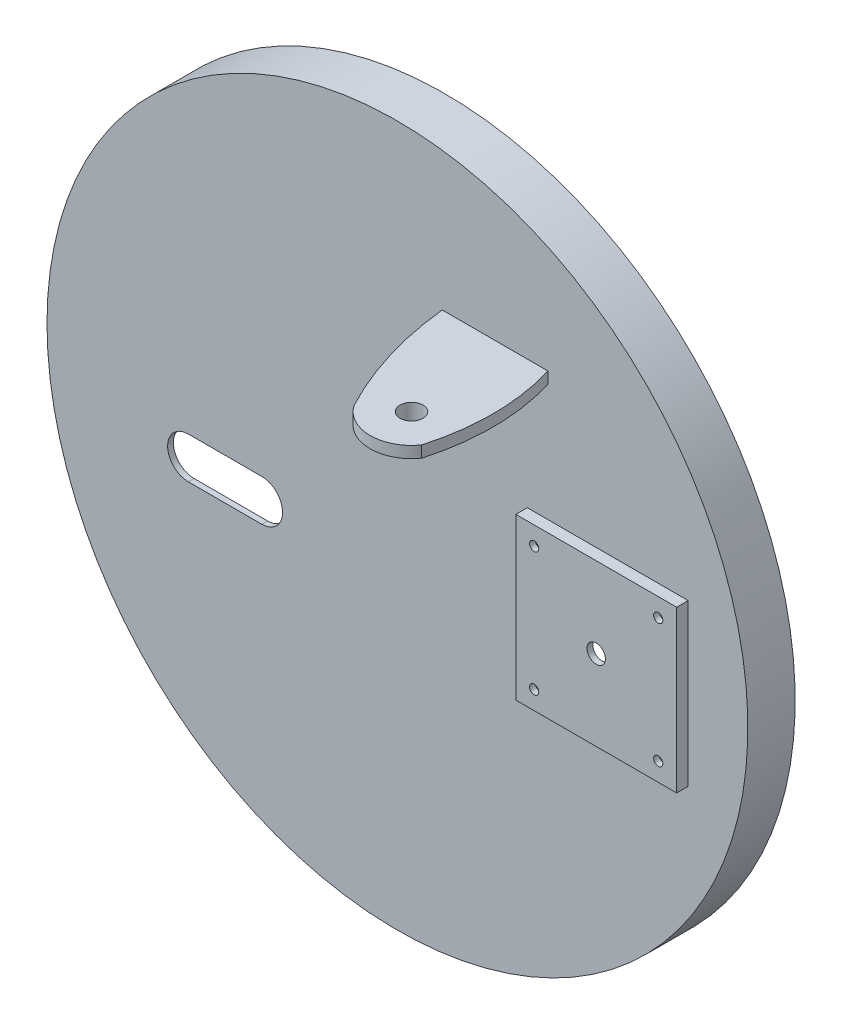
ISO-10303-21;
HEADER;
FILE_DESCRIPTION(('STEP AP214'),'2;1');
FILE_NAME('part.step','',(''),(''),'','','');
FILE_SCHEMA(('AUTOMOTIVE_DESIGN { 1 0 10303 214 1 1 1 1 }'));
ENDSEC;
DATA;
#1=APPLICATION_CONTEXT('core data for automotive mechanical design processes');
#2=APPLICATION_PROTOCOL_DEFINITION('international standard','automotive_design',2000,#1);
#3=PRODUCT_CONTEXT('',#1,'mechanical');
#4=PRODUCT('Part','Part','',(#3));
#5=PRODUCT_RELATED_PRODUCT_CATEGORY('part','',(#4));
#6=PRODUCT_DEFINITION_FORMATION('','',#4);
#7=PRODUCT_DEFINITION_CONTEXT('part definition',#1,'design');
#8=PRODUCT_DEFINITION('design','',#6,#7);
#9=PRODUCT_DEFINITION_SHAPE('','',#8);
#10=(LENGTH_UNIT() NAMED_UNIT(*) SI_UNIT(.MILLI.,.METRE.));
#11=(NAMED_UNIT(*) PLANE_ANGLE_UNIT() SI_UNIT($,.RADIAN.));
#12=(NAMED_UNIT(*) SI_UNIT($,.STERADIAN.) SOLID_ANGLE_UNIT());
#13=UNCERTAINTY_MEASURE_WITH_UNIT(LENGTH_MEASURE(1.E-05),#10,'distance_accuracy_value','');
#14=(GEOMETRIC_REPRESENTATION_CONTEXT(3) GLOBAL_UNCERTAINTY_ASSIGNED_CONTEXT((#13)) GLOBAL_UNIT_ASSIGNED_CONTEXT((#10,
#11,#12)) REPRESENTATION_CONTEXT('',''));
#15=CARTESIAN_POINT('',(0.,0.,0.));
#16=DIRECTION('',(0.,0.,1.));
#17=DIRECTION('',(1.,0.,0.));
#18=AXIS2_PLACEMENT_3D('',#15,#16,#17);
#19=CARTESIAN_POINT('',(39.,172.01941469311,191.2));
#20=DIRECTION('',(0.,1.,0.));
#21=DIRECTION('',(0.,0.,1.));
#22=AXIS2_PLACEMENT_3D('',#19,#20,#21);
#23=PLANE('',#22);
#24=CARTESIAN_POINT('',(337.446035567182,172.01941469311,10.7046912750073));
#25=DIRECTION('',(0.,-1.,0.));
#26=DIRECTION('',(0.,0.,-1.));
#27=AXIS2_PLACEMENT_3D('',#24,#25,#26);
#28=CIRCLE('',#27,300.);
#29=CARTESIAN_POINT('',(72.481683860342,172.01941469311,151.395459716203));
#30=VERTEX_POINT('',#29);
#31=CARTESIAN_POINT('',(39.,172.01941469311,41.2));
#32=VERTEX_POINT('',#31);
#33=EDGE_CURVE('E56',#30,#32,#28,.T.);
#34=ORIENTED_EDGE('',*,*,#33,.T.);
#35=DIRECTION('',(1.,0.,0.));
#36=VECTOR('',#35,1.);
#37=CARTESIAN_POINT('',(39.,172.01941469311,41.2));
#38=LINE('',#37,#36);
#39=CARTESIAN_POINT('',(131.,172.01941469311,41.2));
#40=VERTEX_POINT('',#39);
#41=EDGE_CURVE('E175',#32,#40,#38,.T.);
#42=ORIENTED_EDGE('',*,*,#41,.T.);
#43=CARTESIAN_POINT('',(-55.6000664272192,172.01941469311,97.8163864032083));
#44=DIRECTION('',(0.,-1.,0.));
#45=DIRECTION('',(0.,0.,-1.));
#46=AXIS2_PLACEMENT_3D('',#43,#44,#45);
#47=CIRCLE('',#46,195.);
#48=CARTESIAN_POINT('',(131.75873165795,172.01941469311,151.868960625725));
#49=VERTEX_POINT('',#48);
#50=EDGE_CURVE('E159',#40,#49,#47,.T.);
#51=ORIENTED_EDGE('',*,*,#50,.T.);
#52=CARTESIAN_POINT('',(102.283418824119,172.01941469311,131.2));
#53=DIRECTION('',(0.,-1.,0.));
#54=DIRECTION('',(0.,0.,-1.));
#55=AXIS2_PLACEMENT_3D('',#52,#53,#54);
#56=CIRCLE('',#55,36.);
#57=EDGE_CURVE('E169',#49,#30,#56,.T.);
#58=ORIENTED_EDGE('',*,*,#57,.T.);
#59=EDGE_LOOP('',(#34,#42,#51,#58));
#60=FACE_BOUND('',#59,.T.);
#61=CARTESIAN_POINT('',(102.283418824119,172.01941469311,131.2));
#62=DIRECTION('',(0.,1.,0.));
#63=DIRECTION('',(0.,0.,1.));
#64=AXIS2_PLACEMENT_3D('',#61,#62,#63);
#65=CIRCLE('',#64,20.);
#66=CARTESIAN_POINT('',(102.283418824119,172.01941469311,151.2));
#67=VERTEX_POINT('',#66);
#68=EDGE_CURVE('E48',#67,#67,#65,.F.);
#69=ORIENTED_EDGE('',*,*,#68,.F.);
#70=EDGE_LOOP('',(#69));
#71=FACE_BOUND('',#70,.T.);
#72=ADVANCED_FACE('F39',(#60,#71),#23,.F.);
#73=CARTESIAN_POINT('',(39.,182.01941469311,191.2));
#74=DIRECTION('',(0.,-1.,0.));
#75=DIRECTION('',(0.,0.,-1.));
#76=AXIS2_PLACEMENT_3D('',#73,#74,#75);
#77=PLANE('',#76);
#78=CARTESIAN_POINT('',(102.283418824119,182.01941469311,131.2));
#79=DIRECTION('',(0.,-1.,0.));
#80=DIRECTION('',(0.,0.,-1.));
#81=AXIS2_PLACEMENT_3D('',#78,#79,#80);
#82=CIRCLE('',#81,10.);
#83=CARTESIAN_POINT('',(102.283418824119,182.01941469311,121.2));
#84=VERTEX_POINT('',#83);
#85=EDGE_CURVE('E333',#84,#84,#82,.T.);
#86=ORIENTED_EDGE('',*,*,#85,.T.);
#87=EDGE_LOOP('',(#86));
#88=FACE_BOUND('',#87,.T.);
#89=CARTESIAN_POINT('',(337.446035567182,182.01941469311,10.7046912750073));
#90=DIRECTION('',(0.,-1.,0.));
#91=DIRECTION('',(0.,0.,-1.));
#92=AXIS2_PLACEMENT_3D('',#89,#90,#91);
#93=CIRCLE('',#92,300.);
#94=CARTESIAN_POINT('',(72.481683860342,182.01941469311,151.395459716203));
#95=VERTEX_POINT('',#94);
#96=CARTESIAN_POINT('',(39.,182.01941469311,41.2));
#97=VERTEX_POINT('',#96);
#98=EDGE_CURVE('E184',#95,#97,#93,.T.);
#99=ORIENTED_EDGE('',*,*,#98,.F.);
#100=CARTESIAN_POINT('',(102.283418824119,182.01941469311,131.2));
#101=DIRECTION('',(0.,-1.,0.));
#102=DIRECTION('',(0.,0.,-1.));
#103=AXIS2_PLACEMENT_3D('',#100,#101,#102);
#104=CIRCLE('',#103,36.);
#105=CARTESIAN_POINT('',(131.75873165795,182.01941469311,151.868960625725));
#106=VERTEX_POINT('',#105);
#107=EDGE_CURVE('E180',#106,#95,#104,.T.);
#108=ORIENTED_EDGE('',*,*,#107,.F.);
#109=CARTESIAN_POINT('',(-55.6000664272192,182.01941469311,97.8163864032083));
#110=DIRECTION('',(0.,-1.,0.));
#111=DIRECTION('',(0.,0.,-1.));
#112=AXIS2_PLACEMENT_3D('',#109,#110,#111);
#113=CIRCLE('',#112,195.);
#114=CARTESIAN_POINT('',(131.,182.01941469311,41.2));
#115=VERTEX_POINT('',#114);
#116=EDGE_CURVE('E162',#115,#106,#113,.T.);
#117=ORIENTED_EDGE('',*,*,#116,.F.);
#118=DIRECTION('',(-1.,0.,0.));
#119=VECTOR('',#118,1.);
#120=CARTESIAN_POINT('',(39.,182.01941469311,41.2));
#121=LINE('',#120,#119);
#122=EDGE_CURVE('E186',#115,#97,#121,.T.);
#123=ORIENTED_EDGE('',*,*,#122,.T.);
#124=EDGE_LOOP('',(#99,#108,#117,#123));
#125=FACE_BOUND('',#124,.T.);
#126=ADVANCED_FACE('F342',(#88,#125),#77,.F.);
#127=CARTESIAN_POINT('',(0.,0.,41.2));
#128=DIRECTION('',(0.,0.,1.));
#129=DIRECTION('',(1.,0.,0.));
#130=AXIS2_PLACEMENT_3D('',#127,#128,#129);
#131=PLANE('',#130);
#132=DIRECTION('',(0.,-1.,0.));
#133=VECTOR('',#132,1.);
#134=CARTESIAN_POINT('',(39.,182.01941469311,41.2));
#135=LINE('',#134,#133);
#136=EDGE_CURVE('E189',#97,#32,#135,.T.);
#137=ORIENTED_EDGE('',*,*,#136,.F.);
#138=ORIENTED_EDGE('',*,*,#122,.F.);
#139=DIRECTION('',(0.,-1.,0.));
#140=VECTOR('',#139,1.);
#141=CARTESIAN_POINT('',(131.,322.01941469311,41.2));
#142=LINE('',#141,#140);
#143=EDGE_CURVE('E165',#115,#40,#142,.T.);
#144=ORIENTED_EDGE('',*,*,#143,.T.);
#145=ORIENTED_EDGE('',*,*,#41,.F.);
#146=EDGE_LOOP('',(#137,#138,#144,#145));
#147=FACE_BOUND('',#146,.T.);
#148=CARTESIAN_POINT('',(0.,0.,41.2));
#149=DIRECTION('',(0.,0.,1.));
#150=DIRECTION('',(1.,0.,0.));
#151=AXIS2_PLACEMENT_3D('',#148,#149,#150);
#152=CIRCLE('',#151,305.);
#153=CARTESIAN_POINT('',(-305.,0.,41.2));
#154=VERTEX_POINT('',#153);
#155=EDGE_CURVE('E282',#154,#154,#152,.T.);
#156=ORIENTED_EDGE('',*,*,#155,.T.);
#157=EDGE_LOOP('',(#156));
#158=FACE_BOUND('',#157,.T.);
#159=DIRECTION('',(0.,-1.,0.));
#160=VECTOR('',#159,1.);
#161=CARTESIAN_POINT('',(253.,70.,41.2));
#162=LINE('',#161,#160);
#163=CARTESIAN_POINT('',(253.,70.,41.2));
#164=VERTEX_POINT('',#163);
#165=CARTESIAN_POINT('',(253.,-70.,41.2));
#166=VERTEX_POINT('',#165);
#167=EDGE_CURVE('E265',#164,#166,#162,.T.);
#168=ORIENTED_EDGE('',*,*,#167,.T.);
#169=DIRECTION('',(1.,0.,0.));
#170=VECTOR('',#169,1.);
#171=CARTESIAN_POINT('',(113.,-70.,41.2));
#172=LINE('',#171,#170);
#173=CARTESIAN_POINT('',(113.,-70.,41.2));
#174=VERTEX_POINT('',#173);
#175=EDGE_CURVE('E217',#174,#166,#172,.T.);
#176=ORIENTED_EDGE('',*,*,#175,.F.);
#177=DIRECTION('',(0.,-1.,0.));
#178=VECTOR('',#177,1.);
#179=CARTESIAN_POINT('',(113.,70.,41.2));
#180=LINE('',#179,#178);
#181=CARTESIAN_POINT('',(113.,70.,41.2));
#182=VERTEX_POINT('',#181);
#183=EDGE_CURVE('E254',#182,#174,#180,.T.);
#184=ORIENTED_EDGE('',*,*,#183,.F.);
#185=DIRECTION('',(1.,0.,0.));
#186=VECTOR('',#185,1.);
#187=CARTESIAN_POINT('',(113.,70.,41.2));
#188=LINE('',#187,#186);
#189=EDGE_CURVE('E268',#182,#164,#188,.T.);
#190=ORIENTED_EDGE('',*,*,#189,.T.);
#191=EDGE_LOOP('',(#168,#176,#184,#190));
#192=FACE_BOUND('',#191,.T.);
#193=DIRECTION('',(-1.,0.,0.));
#194=VECTOR('',#193,1.);
#195=CARTESIAN_POINT('',(0.,-58.,41.2));
#196=LINE('',#195,#194);
#197=CARTESIAN_POINT('',(-118.,-58.,41.2));
#198=VERTEX_POINT('',#197);
#199=CARTESIAN_POINT('',(-182.,-58.,41.2));
#200=VERTEX_POINT('',#199);
#201=EDGE_CURVE('E207',#198,#200,#196,.T.);
#202=ORIENTED_EDGE('',*,*,#201,.T.);
#203=CARTESIAN_POINT('',(-182.,-40.,41.2));
#204=DIRECTION('',(0.,0.,1.));
#205=DIRECTION('',(1.,0.,0.));
#206=AXIS2_PLACEMENT_3D('',#203,#204,#205);
#207=CIRCLE('',#206,18.);
#208=CARTESIAN_POINT('',(-182.,-22.,41.2));
#209=VERTEX_POINT('',#208);
#210=EDGE_CURVE('E210',#200,#209,#207,.F.);
#211=ORIENTED_EDGE('',*,*,#210,.T.);
#212=DIRECTION('',(1.,0.,0.));
#213=VECTOR('',#212,1.);
#214=CARTESIAN_POINT('',(0.,-22.,41.2));
#215=LINE('',#214,#213);
#216=CARTESIAN_POINT('',(-118.,-22.,41.2));
#217=VERTEX_POINT('',#216);
#218=EDGE_CURVE('E201',#209,#217,#215,.T.);
#219=ORIENTED_EDGE('',*,*,#218,.T.);
#220=CARTESIAN_POINT('',(-118.,-40.,41.2));
#221=DIRECTION('',(0.,0.,1.));
#222=DIRECTION('',(1.,0.,0.));
#223=AXIS2_PLACEMENT_3D('',#220,#221,#222);
#224=CIRCLE('',#223,18.);
#225=EDGE_CURVE('E204',#217,#198,#224,.F.);
#226=ORIENTED_EDGE('',*,*,#225,.T.);
#227=EDGE_LOOP('',(#202,#211,#219,#226));
#228=FACE_BOUND('',#227,.T.);
#229=ADVANCED_FACE('F337',(#147,#158,#192,#228),#131,.T.);
#230=CARTESIAN_POINT('',(0.,0.,36.2));
#231=DIRECTION('',(0.,0.,1.));
#232=DIRECTION('',(1.,0.,0.));
#233=AXIS2_PLACEMENT_3D('',#230,#231,#232);
#234=PLANE('',#233);
#235=CARTESIAN_POINT('',(0.,0.,36.2));
#236=DIRECTION('',(0.,0.,1.));
#237=DIRECTION('',(1.,0.,0.));
#238=AXIS2_PLACEMENT_3D('',#235,#236,#237);
#239=CIRCLE('',#238,85.);
#240=CARTESIAN_POINT('',(85.,0.,36.2));
#241=VERTEX_POINT('',#240);
#242=EDGE_CURVE('E11',#241,#241,#239,.F.);
#243=ORIENTED_EDGE('',*,*,#242,.F.);
#244=EDGE_LOOP('',(#243));
#245=FACE_BOUND('',#244,.T.);
#246=DIRECTION('',(0.,-1.,0.));
#247=VECTOR('',#246,1.);
#248=CARTESIAN_POINT('',(248.,70.,36.2));
#249=LINE('',#248,#247);
#250=CARTESIAN_POINT('',(248.,65.,36.2));
#251=VERTEX_POINT('',#250);
#252=CARTESIAN_POINT('',(248.,-65.,36.2));
#253=VERTEX_POINT('',#252);
#254=EDGE_CURVE('E219',#251,#253,#249,.T.);
#255=ORIENTED_EDGE('',*,*,#254,.F.);
#256=DIRECTION('',(1.,0.,0.));
#257=VECTOR('',#256,1.);
#258=CARTESIAN_POINT('',(113.,65.,36.2));
#259=LINE('',#258,#257);
#260=CARTESIAN_POINT('',(118.,65.,36.2));
#261=VERTEX_POINT('',#260);
#262=EDGE_CURVE('E222',#261,#251,#259,.T.);
#263=ORIENTED_EDGE('',*,*,#262,.F.);
#264=DIRECTION('',(0.,-1.,0.));
#265=VECTOR('',#264,1.);
#266=CARTESIAN_POINT('',(118.,70.,36.2));
#267=LINE('',#266,#265);
#268=CARTESIAN_POINT('',(118.,-65.,36.2));
#269=VERTEX_POINT('',#268);
#270=EDGE_CURVE('E225',#261,#269,#267,.T.);
#271=ORIENTED_EDGE('',*,*,#270,.T.);
#272=DIRECTION('',(1.,0.,0.));
#273=VECTOR('',#272,1.);
#274=CARTESIAN_POINT('',(113.,-65.,36.2));
#275=LINE('',#274,#273);
#276=EDGE_CURVE('E213',#269,#253,#275,.T.);
#277=ORIENTED_EDGE('',*,*,#276,.T.);
#278=EDGE_LOOP('',(#255,#263,#271,#277));
#279=FACE_BOUND('',#278,.T.);
#280=CARTESIAN_POINT('',(0.,0.,36.2));
#281=DIRECTION('',(0.,0.,1.));
#282=DIRECTION('',(1.,0.,0.));
#283=AXIS2_PLACEMENT_3D('',#280,#281,#282);
#284=CIRCLE('',#283,300.);
#285=CARTESIAN_POINT('',(-300.,0.,36.2));
#286=VERTEX_POINT('',#285);
#287=EDGE_CURVE('E214',#286,#286,#284,.T.);
#288=ORIENTED_EDGE('',*,*,#287,.F.);
#289=EDGE_LOOP('',(#288));
#290=FACE_BOUND('',#289,.T.);
#291=CARTESIAN_POINT('',(-182.,-40.,36.2));
#292=DIRECTION('',(0.,0.,1.));
#293=DIRECTION('',(1.,0.,0.));
#294=AXIS2_PLACEMENT_3D('',#291,#292,#293);
#295=CIRCLE('',#294,18.);
#296=CARTESIAN_POINT('',(-182.,-58.,36.2));
#297=VERTEX_POINT('',#296);
#298=CARTESIAN_POINT('',(-182.,-22.,36.2));
#299=VERTEX_POINT('',#298);
#300=EDGE_CURVE('E293',#297,#299,#295,.F.);
#301=ORIENTED_EDGE('',*,*,#300,.F.);
#302=DIRECTION('',(-1.,0.,0.));
#303=VECTOR('',#302,1.);
#304=CARTESIAN_POINT('',(0.,-58.,36.2));
#305=LINE('',#304,#303);
#306=CARTESIAN_POINT('',(-118.,-58.,36.2));
#307=VERTEX_POINT('',#306);
#308=EDGE_CURVE('E291',#307,#297,#305,.T.);
#309=ORIENTED_EDGE('',*,*,#308,.F.);
#310=CARTESIAN_POINT('',(-118.,-40.,36.2));
#311=DIRECTION('',(0.,0.,1.));
#312=DIRECTION('',(1.,0.,0.));
#313=AXIS2_PLACEMENT_3D('',#310,#311,#312);
#314=CIRCLE('',#313,18.);
#315=CARTESIAN_POINT('',(-118.,-22.,36.2));
#316=VERTEX_POINT('',#315);
#317=EDGE_CURVE('E289',#316,#307,#314,.F.);
#318=ORIENTED_EDGE('',*,*,#317,.F.);
#319=DIRECTION('',(1.,0.,0.));
#320=VECTOR('',#319,1.);
#321=CARTESIAN_POINT('',(0.,-22.,36.2));
#322=LINE('',#321,#320);
#323=EDGE_CURVE('E285',#299,#316,#322,.T.);
#324=ORIENTED_EDGE('',*,*,#323,.F.);
#325=EDGE_LOOP('',(#301,#309,#318,#324));
#326=FACE_BOUND('',#325,.T.);
#327=ADVANCED_FACE('F375',(#245,#279,#290,#326),#234,.F.);
#328=CARTESIAN_POINT('',(0.,0.,41.2));
#329=DIRECTION('',(0.,0.,-1.));
#330=DIRECTION('',(-1.,0.,0.));
#331=AXIS2_PLACEMENT_3D('',#328,#329,#330);
#332=CYLINDRICAL_SURFACE('',#331,305.);
#333=CARTESIAN_POINT('',(0.,0.,0.));
#334=DIRECTION('',(0.,0.,1.));
#335=DIRECTION('',(1.,0.,0.));
#336=AXIS2_PLACEMENT_3D('',#333,#334,#335);
#337=CIRCLE('',#336,305.);
#338=CARTESIAN_POINT('',(-305.,0.,0.));
#339=VERTEX_POINT('',#338);
#340=EDGE_CURVE('E281',#339,#339,#337,.T.);
#341=CARTESIAN_POINT('',(-305.,0.,41.2));
#342=CARTESIAN_POINT('',(-305.,0.,40.7708333333333));
#343=CARTESIAN_POINT('',(-305.,0.,40.3416666666667));
#344=CARTESIAN_POINT('',(-305.,0.,39.4833333333333));
#345=CARTESIAN_POINT('',(-305.,0.,39.0541666666667));
#346=CARTESIAN_POINT('',(-305.,0.,38.1958333333333));
#347=CARTESIAN_POINT('',(-305.,0.,37.7666666666667));
#348=CARTESIAN_POINT('',(-305.,0.,36.9083333333333));
#349=CARTESIAN_POINT('',(-305.,0.,36.4791666666667));
#350=CARTESIAN_POINT('',(-305.,0.,35.6208333333333));
#351=CARTESIAN_POINT('',(-305.,0.,35.1916666666667));
#352=CARTESIAN_POINT('',(-305.,0.,34.3333333333333));
#353=CARTESIAN_POINT('',(-305.,0.,33.9041666666667));
#354=CARTESIAN_POINT('',(-305.,0.,33.0458333333333));
#355=CARTESIAN_POINT('',(-305.,0.,32.6166666666667));
#356=CARTESIAN_POINT('',(-305.,0.,31.7583333333333));
#357=CARTESIAN_POINT('',(-305.,0.,31.3291666666667));
#358=CARTESIAN_POINT('',(-305.,0.,30.4708333333333));
#359=CARTESIAN_POINT('',(-305.,0.,30.0416666666667));
#360=CARTESIAN_POINT('',(-305.,0.,29.1833333333333));
#361=CARTESIAN_POINT('',(-305.,0.,28.7541666666667));
#362=CARTESIAN_POINT('',(-305.,0.,27.8958333333333));
#363=CARTESIAN_POINT('',(-305.,0.,27.4666666666667));
#364=CARTESIAN_POINT('',(-305.,0.,26.6083333333333));
#365=CARTESIAN_POINT('',(-305.,0.,26.1791666666667));
#366=CARTESIAN_POINT('',(-305.,0.,25.3208333333333));
#367=CARTESIAN_POINT('',(-305.,0.,24.8916666666667));
#368=CARTESIAN_POINT('',(-305.,0.,24.0333333333333));
#369=CARTESIAN_POINT('',(-305.,0.,23.6041666666667));
#370=CARTESIAN_POINT('',(-305.,0.,22.7458333333333));
#371=CARTESIAN_POINT('',(-305.,0.,22.3166666666667));
#372=CARTESIAN_POINT('',(-305.,0.,21.4583333333333));
#373=CARTESIAN_POINT('',(-305.,0.,21.0291666666667));
#374=CARTESIAN_POINT('',(-305.,0.,20.1708333333333));
#375=CARTESIAN_POINT('',(-305.,0.,19.7416666666667));
#376=CARTESIAN_POINT('',(-305.,0.,18.8833333333333));
#377=CARTESIAN_POINT('',(-305.,0.,18.4541666666667));
#378=CARTESIAN_POINT('',(-305.,0.,17.5958333333333));
#379=CARTESIAN_POINT('',(-305.,0.,17.1666666666667));
#380=CARTESIAN_POINT('',(-305.,0.,16.3083333333333));
#381=CARTESIAN_POINT('',(-305.,0.,15.8791666666667));
#382=CARTESIAN_POINT('',(-305.,0.,15.0208333333333));
#383=CARTESIAN_POINT('',(-305.,0.,14.5916666666667));
#384=CARTESIAN_POINT('',(-305.,0.,13.7333333333333));
#385=CARTESIAN_POINT('',(-305.,0.,13.3041666666667));
#386=CARTESIAN_POINT('',(-305.,0.,12.4458333333333));
#387=CARTESIAN_POINT('',(-305.,0.,12.0166666666667));
#388=CARTESIAN_POINT('',(-305.,0.,11.1583333333333));
#389=CARTESIAN_POINT('',(-305.,0.,10.7291666666667));
#390=CARTESIAN_POINT('',(-305.,0.,9.87083333333333));
#391=CARTESIAN_POINT('',(-305.,0.,9.44166666666666));
#392=CARTESIAN_POINT('',(-305.,0.,8.58333333333333));
#393=CARTESIAN_POINT('',(-305.,0.,8.15416666666666));
#394=CARTESIAN_POINT('',(-305.,0.,7.29583333333333));
#395=CARTESIAN_POINT('',(-305.,0.,6.86666666666666));
#396=CARTESIAN_POINT('',(-305.,0.,6.00833333333333));
#397=CARTESIAN_POINT('',(-305.,0.,5.57916666666666));
#398=CARTESIAN_POINT('',(-305.,0.,4.72083333333333));
#399=CARTESIAN_POINT('',(-305.,0.,4.29166666666666));
#400=CARTESIAN_POINT('',(-305.,0.,3.43333333333333));
#401=CARTESIAN_POINT('',(-305.,0.,3.00416666666666));
#402=CARTESIAN_POINT('',(-305.,0.,2.14583333333333));
#403=CARTESIAN_POINT('',(-305.,0.,1.71666666666666));
#404=CARTESIAN_POINT('',(-305.,0.,0.858333333333325));
#405=CARTESIAN_POINT('',(-305.,0.,0.429166666666659));
#406=CARTESIAN_POINT('',(-305.,0.,0.));
#407=B_SPLINE_CURVE_WITH_KNOTS('',3,(#341,#342,#343,#344,#345,#346,#347,#348,#349,#350,#351,
#352,#353,#354,#355,#356,#357,#358,#359,#360,#361,#362,#363,#364,#365,#366,#367,#368,#369,#370,
#371,#372,#373,#374,#375,#376,#377,#378,#379,#380,#381,#382,#383,#384,#385,#386,#387,#388,#389,
#390,#391,#392,#393,#394,#395,#396,#397,#398,#399,#400,#401,#402,#403,#404,#405,#406),
.UNSPECIFIED.,.F.,.F.,(4,2,2,2,2,2,2,2,2,2,2,2,2,2,2,2,2,2,2,2,2,2,2,2,2,2,2,2,2,2,2,2,4),(0.,
1.2875,2.575,3.8625,5.15,6.43750000000001,7.725,9.01250000000001,10.3,11.5875,12.875,14.1625,
15.45,16.7375,18.025,19.3125,20.6,21.8875,23.175,24.4625,25.75,27.0375,28.325,29.6125,30.9,
32.1875,33.475,34.7625,36.05,37.3375,38.625,39.9125,41.2),.UNSPECIFIED.);
#408=EDGE_CURVE('BSEAM41',#154,#339,#407,.T.);
#409=ORIENTED_EDGE('',*,*,#155,.F.);
#410=ORIENTED_EDGE('',*,*,#340,.T.);
#411=ORIENTED_EDGE('',*,*,#408,.T.);
#412=ORIENTED_EDGE('',*,*,#408,.F.);
#413=EDGE_LOOP('',(#409,#411,#410,#412));
#414=FACE_BOUND('',#413,.T.);
#415=ADVANCED_FACE('F41',(#414),#332,.T.);
#416=CARTESIAN_POINT('',(0.,0.,0.));
#417=DIRECTION('',(0.,0.,1.));
#418=DIRECTION('',(1.,0.,0.));
#419=AXIS2_PLACEMENT_3D('',#416,#417,#418);
#420=PLANE('',#419);
#421=CARTESIAN_POINT('',(0.,0.,0.));
#422=DIRECTION('',(0.,0.,1.));
#423=DIRECTION('',(1.,0.,0.));
#424=AXIS2_PLACEMENT_3D('',#421,#422,#423);
#425=CIRCLE('',#424,300.);
#426=CARTESIAN_POINT('',(-300.,0.,0.));
#427=VERTEX_POINT('',#426);
#428=EDGE_CURVE('E218',#427,#427,#425,.T.);
#429=ORIENTED_EDGE('',*,*,#428,.T.);
#430=EDGE_LOOP('',(#429));
#431=FACE_BOUND('',#430,.T.);
#432=ORIENTED_EDGE('',*,*,#340,.F.);
#433=EDGE_LOOP('',(#432));
#434=FACE_BOUND('',#433,.T.);
#435=ADVANCED_FACE('F421',(#431,#434),#420,.F.);
#436=CARTESIAN_POINT('',(113.,-70.,51.2));
#437=DIRECTION('',(0.,1.,0.));
#438=DIRECTION('',(0.,0.,1.));
#439=AXIS2_PLACEMENT_3D('',#436,#437,#438);
#440=PLANE('',#439);
#441=ORIENTED_EDGE('',*,*,#175,.T.);
#442=DIRECTION('',(0.,0.,-1.));
#443=VECTOR('',#442,1.);
#444=CARTESIAN_POINT('',(253.,-70.,51.2));
#445=LINE('',#444,#443);
#446=CARTESIAN_POINT('',(253.,-70.,51.2));
#447=VERTEX_POINT('',#446);
#448=EDGE_CURVE('E279',#447,#166,#445,.T.);
#449=ORIENTED_EDGE('',*,*,#448,.F.);
#450=DIRECTION('',(1.,0.,0.));
#451=VECTOR('',#450,1.);
#452=CARTESIAN_POINT('',(113.,-70.,51.2));
#453=LINE('',#452,#451);
#454=CARTESIAN_POINT('',(113.,-70.,51.2));
#455=VERTEX_POINT('',#454);
#456=EDGE_CURVE('E251',#455,#447,#453,.T.);
#457=ORIENTED_EDGE('',*,*,#456,.F.);
#458=DIRECTION('',(0.,0.,-1.));
#459=VECTOR('',#458,1.);
#460=CARTESIAN_POINT('',(113.,-70.,51.2));
#461=LINE('',#460,#459);
#462=EDGE_CURVE('E262',#455,#174,#461,.T.);
#463=ORIENTED_EDGE('',*,*,#462,.T.);
#464=EDGE_LOOP('',(#441,#449,#457,#463));
#465=FACE_BOUND('',#464,.T.);
#466=ADVANCED_FACE('F417',(#465),#440,.F.);
#467=CARTESIAN_POINT('',(253.,70.,51.2));
#468=DIRECTION('',(1.,0.,0.));
#469=DIRECTION('',(0.,1.,0.));
#470=AXIS2_PLACEMENT_3D('',#467,#468,#469);
#471=PLANE('',#470);
#472=ORIENTED_EDGE('',*,*,#167,.F.);
#473=DIRECTION('',(0.,0.,-1.));
#474=VECTOR('',#473,1.);
#475=CARTESIAN_POINT('',(253.,70.,51.2));
#476=LINE('',#475,#474);
#477=CARTESIAN_POINT('',(253.,70.,51.2));
#478=VERTEX_POINT('',#477);
#479=EDGE_CURVE('E277',#478,#164,#476,.T.);
#480=ORIENTED_EDGE('',*,*,#479,.F.);
#481=DIRECTION('',(0.,-1.,0.));
#482=VECTOR('',#481,1.);
#483=CARTESIAN_POINT('',(253.,70.,51.2));
#484=LINE('',#483,#482);
#485=EDGE_CURVE('E253',#478,#447,#484,.T.);
#486=ORIENTED_EDGE('',*,*,#485,.T.);
#487=ORIENTED_EDGE('',*,*,#448,.T.);
#488=EDGE_LOOP('',(#472,#480,#486,#487));
#489=FACE_BOUND('',#488,.T.);
#490=ADVANCED_FACE('F413',(#489),#471,.T.);
#491=CARTESIAN_POINT('',(113.,70.,51.2));
#492=DIRECTION('',(0.,1.,0.));
#493=DIRECTION('',(0.,0.,1.));
#494=AXIS2_PLACEMENT_3D('',#491,#492,#493);
#495=PLANE('',#494);
#496=ORIENTED_EDGE('',*,*,#189,.F.);
#497=DIRECTION('',(0.,0.,-1.));
#498=VECTOR('',#497,1.);
#499=CARTESIAN_POINT('',(113.,70.,51.2));
#500=LINE('',#499,#498);
#501=CARTESIAN_POINT('',(113.,70.,51.2));
#502=VERTEX_POINT('',#501);
#503=EDGE_CURVE('E274',#502,#182,#500,.T.);
#504=ORIENTED_EDGE('',*,*,#503,.F.);
#505=DIRECTION('',(1.,0.,0.));
#506=VECTOR('',#505,1.);
#507=CARTESIAN_POINT('',(113.,70.,51.2));
#508=LINE('',#507,#506);
#509=EDGE_CURVE('E257',#502,#478,#508,.T.);
#510=ORIENTED_EDGE('',*,*,#509,.T.);
#511=ORIENTED_EDGE('',*,*,#479,.T.);
#512=EDGE_LOOP('',(#496,#504,#510,#511));
#513=FACE_BOUND('',#512,.T.);
#514=ADVANCED_FACE('F409',(#513),#495,.T.);
#515=CARTESIAN_POINT('',(113.,70.,51.2));
#516=DIRECTION('',(1.,0.,0.));
#517=DIRECTION('',(0.,1.,0.));
#518=AXIS2_PLACEMENT_3D('',#515,#516,#517);
#519=PLANE('',#518);
#520=ORIENTED_EDGE('',*,*,#183,.T.);
#521=ORIENTED_EDGE('',*,*,#462,.F.);
#522=DIRECTION('',(0.,-1.,0.));
#523=VECTOR('',#522,1.);
#524=CARTESIAN_POINT('',(113.,70.,51.2));
#525=LINE('',#524,#523);
#526=EDGE_CURVE('E260',#502,#455,#525,.T.);
#527=ORIENTED_EDGE('',*,*,#526,.F.);
#528=ORIENTED_EDGE('',*,*,#503,.T.);
#529=EDGE_LOOP('',(#520,#521,#527,#528));
#530=FACE_BOUND('',#529,.T.);
#531=ADVANCED_FACE('F405',(#530),#519,.F.);
#532=CARTESIAN_POINT('',(0.,0.,51.2));
#533=DIRECTION('',(0.,0.,-1.));
#534=DIRECTION('',(-1.,0.,0.));
#535=AXIS2_PLACEMENT_3D('',#532,#533,#534);
#536=PLANE('',#535);
#537=CARTESIAN_POINT('',(183.,0.,51.2));
#538=DIRECTION('',(0.,0.,1.));
#539=DIRECTION('',(1.,0.,0.));
#540=AXIS2_PLACEMENT_3D('',#537,#538,#539);
#541=CIRCLE('',#540,8.00000000000001);
#542=CARTESIAN_POINT('',(191.,0.,51.2));
#543=VERTEX_POINT('',#542);
#544=EDGE_CURVE('E797',#543,#543,#541,.T.);
#545=ORIENTED_EDGE('',*,*,#544,.F.);
#546=EDGE_LOOP('',(#545));
#547=FACE_BOUND('',#546,.T.);
#548=CARTESIAN_POINT('',(237.,54.,51.2));
#549=DIRECTION('',(0.,0.,1.));
#550=DIRECTION('',(1.,0.,0.));
#551=AXIS2_PLACEMENT_3D('',#548,#549,#550);
#552=CIRCLE('',#551,3.99999999999999);
#553=CARTESIAN_POINT('',(241.,54.,51.2));
#554=VERTEX_POINT('',#553);
#555=EDGE_CURVE('E798',#554,#554,#552,.T.);
#556=ORIENTED_EDGE('',*,*,#555,.F.);
#557=EDGE_LOOP('',(#556));
#558=FACE_BOUND('',#557,.T.);
#559=CARTESIAN_POINT('',(129.,-54.,51.2));
#560=DIRECTION('',(0.,0.,1.));
#561=DIRECTION('',(1.,0.,0.));
#562=AXIS2_PLACEMENT_3D('',#559,#560,#561);
#563=CIRCLE('',#562,3.99999999999999);
#564=CARTESIAN_POINT('',(133.,-54.,51.2));
#565=VERTEX_POINT('',#564);
#566=EDGE_CURVE('E801',#565,#565,#563,.T.);
#567=ORIENTED_EDGE('',*,*,#566,.F.);
#568=EDGE_LOOP('',(#567));
#569=FACE_BOUND('',#568,.T.);
#570=CARTESIAN_POINT('',(237.,-54.,51.2));
#571=DIRECTION('',(0.,0.,1.));
#572=DIRECTION('',(1.,0.,0.));
#573=AXIS2_PLACEMENT_3D('',#570,#571,#572);
#574=CIRCLE('',#573,3.99999999999999);
#575=CARTESIAN_POINT('',(241.,-54.,51.2));
#576=VERTEX_POINT('',#575);
#577=EDGE_CURVE('E805',#576,#576,#574,.T.);
#578=ORIENTED_EDGE('',*,*,#577,.F.);
#579=EDGE_LOOP('',(#578));
#580=FACE_BOUND('',#579,.T.);
#581=CARTESIAN_POINT('',(129.,54.,51.2));
#582=DIRECTION('',(0.,0.,1.));
#583=DIRECTION('',(1.,0.,0.));
#584=AXIS2_PLACEMENT_3D('',#581,#582,#583);
#585=CIRCLE('',#584,3.99999999999999);
#586=CARTESIAN_POINT('',(133.,54.,51.2));
#587=VERTEX_POINT('',#586);
#588=EDGE_CURVE('E302',#587,#587,#585,.T.);
#589=ORIENTED_EDGE('',*,*,#588,.F.);
#590=EDGE_LOOP('',(#589));
#591=FACE_BOUND('',#590,.T.);
#592=ORIENTED_EDGE('',*,*,#456,.T.);
#593=ORIENTED_EDGE('',*,*,#485,.F.);
#594=ORIENTED_EDGE('',*,*,#509,.F.);
#595=ORIENTED_EDGE('',*,*,#526,.T.);
#596=EDGE_LOOP('',(#592,#593,#594,#595));
#597=FACE_BOUND('',#596,.T.);
#598=ADVANCED_FACE('F383',(#547,#558,#569,#580,#591,#597),#536,.F.);
#599=CARTESIAN_POINT('',(0.,0.,41.2));
#600=DIRECTION('',(0.,0.,-1.));
#601=DIRECTION('',(-1.,0.,0.));
#602=AXIS2_PLACEMENT_3D('',#599,#600,#601);
#603=CYLINDRICAL_SURFACE('',#602,300.);
#604=CARTESIAN_POINT('',(-300.,0.,36.2));
#605=CARTESIAN_POINT('',(-300.,0.,35.8229166666667));
#606=CARTESIAN_POINT('',(-300.,0.,35.4458333333333));
#607=CARTESIAN_POINT('',(-300.,0.,34.6916666666667));
#608=CARTESIAN_POINT('',(-300.,0.,34.3145833333333));
#609=CARTESIAN_POINT('',(-300.,0.,33.5604166666667));
#610=CARTESIAN_POINT('',(-300.,0.,33.1833333333333));
#611=CARTESIAN_POINT('',(-300.,0.,32.4291666666667));
#612=CARTESIAN_POINT('',(-300.,0.,32.0520833333333));
#613=CARTESIAN_POINT('',(-300.,0.,31.2979166666667));
#614=CARTESIAN_POINT('',(-300.,0.,30.9208333333333));
#615=CARTESIAN_POINT('',(-300.,0.,30.1666666666667));
#616=CARTESIAN_POINT('',(-300.,0.,29.7895833333333));
#617=CARTESIAN_POINT('',(-300.,0.,29.0354166666667));
#618=CARTESIAN_POINT('',(-300.,0.,28.6583333333333));
#619=CARTESIAN_POINT('',(-300.,0.,27.9041666666667));
#620=CARTESIAN_POINT('',(-300.,0.,27.5270833333333));
#621=CARTESIAN_POINT('',(-300.,0.,26.7729166666667));
#622=CARTESIAN_POINT('',(-300.,0.,26.3958333333333));
#623=CARTESIAN_POINT('',(-300.,0.,25.6416666666667));
#624=CARTESIAN_POINT('',(-300.,0.,25.2645833333333));
#625=CARTESIAN_POINT('',(-300.,0.,24.5104166666667));
#626=CARTESIAN_POINT('',(-300.,0.,24.1333333333333));
#627=CARTESIAN_POINT('',(-300.,0.,23.3791666666667));
#628=CARTESIAN_POINT('',(-300.,0.,23.0020833333333));
#629=CARTESIAN_POINT('',(-300.,0.,22.2479166666667));
#630=CARTESIAN_POINT('',(-300.,0.,21.8708333333333));
#631=CARTESIAN_POINT('',(-300.,0.,21.1166666666667));
#632=CARTESIAN_POINT('',(-300.,0.,20.7395833333333));
#633=CARTESIAN_POINT('',(-300.,0.,19.9854166666667));
#634=CARTESIAN_POINT('',(-300.,0.,19.6083333333333));
#635=CARTESIAN_POINT('',(-300.,0.,18.8541666666667));
#636=CARTESIAN_POINT('',(-300.,0.,18.4770833333333));
#637=CARTESIAN_POINT('',(-300.,0.,17.7229166666667));
#638=CARTESIAN_POINT('',(-300.,0.,17.3458333333333));
#639=CARTESIAN_POINT('',(-300.,0.,16.5916666666667));
#640=CARTESIAN_POINT('',(-300.,0.,16.2145833333333));
#641=CARTESIAN_POINT('',(-300.,0.,15.4604166666667));
#642=CARTESIAN_POINT('',(-300.,0.,15.0833333333333));
#643=CARTESIAN_POINT('',(-300.,0.,14.3291666666667));
#644=CARTESIAN_POINT('',(-300.,0.,13.9520833333333));
#645=CARTESIAN_POINT('',(-300.,0.,13.1979166666667));
#646=CARTESIAN_POINT('',(-300.,0.,12.8208333333333));
#647=CARTESIAN_POINT('',(-300.,0.,12.0666666666667));
#648=CARTESIAN_POINT('',(-300.,0.,11.6895833333333));
#649=CARTESIAN_POINT('',(-300.,0.,10.9354166666667));
#650=CARTESIAN_POINT('',(-300.,0.,10.5583333333333));
#651=CARTESIAN_POINT('',(-300.,0.,9.80416666666666));
#652=CARTESIAN_POINT('',(-300.,0.,9.42708333333333));
#653=CARTESIAN_POINT('',(-300.,0.,8.67291666666666));
#654=CARTESIAN_POINT('',(-300.,0.,8.29583333333333));
#655=CARTESIAN_POINT('',(-300.,0.,7.54166666666666));
#656=CARTESIAN_POINT('',(-300.,0.,7.16458333333333));
#657=CARTESIAN_POINT('',(-300.,0.,6.41041666666666));
#658=CARTESIAN_POINT('',(-300.,0.,6.03333333333333));
#659=CARTESIAN_POINT('',(-300.,0.,5.27916666666666));
#660=CARTESIAN_POINT('',(-300.,0.,4.90208333333333));
#661=CARTESIAN_POINT('',(-300.,0.,4.14791666666666));
#662=CARTESIAN_POINT('',(-300.,0.,3.77083333333333));
#663=CARTESIAN_POINT('',(-300.,0.,3.01666666666666));
#664=CARTESIAN_POINT('',(-300.,0.,2.63958333333333));
#665=CARTESIAN_POINT('',(-300.,0.,1.88541666666666));
#666=CARTESIAN_POINT('',(-300.,0.,1.50833333333333));
#667=CARTESIAN_POINT('',(-300.,0.,0.75416666666666));
#668=CARTESIAN_POINT('',(-300.,0.,0.377083333333327));
#669=CARTESIAN_POINT('',(-300.,0.,0.));
#670=B_SPLINE_CURVE_WITH_KNOTS('',3,(#604,#605,#606,#607,#608,#609,#610,#611,#612,#613,#614,
#615,#616,#617,#618,#619,#620,#621,#622,#623,#624,#625,#626,#627,#628,#629,#630,#631,#632,#633,
#634,#635,#636,#637,#638,#639,#640,#641,#642,#643,#644,#645,#646,#647,#648,#649,#650,#651,#652,
#653,#654,#655,#656,#657,#658,#659,#660,#661,#662,#663,#664,#665,#666,#667,#668,#669),
.UNSPECIFIED.,.F.,.F.,(4,2,2,2,2,2,2,2,2,2,2,2,2,2,2,2,2,2,2,2,2,2,2,2,2,2,2,2,2,2,2,2,4),(0.,
1.13125,2.2625,3.39375,4.525,5.65625,6.7875,7.91875,9.05,10.18125,11.3125,12.44375,13.575,
14.70625,15.8375,16.96875,18.1,19.23125,20.3625,21.49375,22.625,23.75625,24.8875,26.01875,27.15,
28.28125,29.4125,30.54375,31.675,32.80625,33.9375,35.06875,36.2),.UNSPECIFIED.);
#671=EDGE_CURVE('BSEAM379',#286,#427,#670,.T.);
#672=ORIENTED_EDGE('',*,*,#287,.T.);
#673=ORIENTED_EDGE('',*,*,#428,.F.);
#674=ORIENTED_EDGE('',*,*,#671,.T.);
#675=ORIENTED_EDGE('',*,*,#671,.F.);
#676=EDGE_LOOP('',(#672,#674,#673,#675));
#677=FACE_BOUND('',#676,.T.);
#678=ADVANCED_FACE('F379',(#677),#603,.F.);
#679=CARTESIAN_POINT('',(113.,-65.,51.2));
#680=DIRECTION('',(0.,1.,0.));
#681=DIRECTION('',(0.,0.,1.));
#682=AXIS2_PLACEMENT_3D('',#679,#680,#681);
#683=PLANE('',#682);
#684=ORIENTED_EDGE('',*,*,#276,.F.);
#685=DIRECTION('',(0.,0.,-1.));
#686=VECTOR('',#685,1.);
#687=CARTESIAN_POINT('',(118.,-65.,51.2));
#688=LINE('',#687,#686);
#689=CARTESIAN_POINT('',(118.,-65.,46.2));
#690=VERTEX_POINT('',#689);
#691=EDGE_CURVE('E235',#690,#269,#688,.T.);
#692=ORIENTED_EDGE('',*,*,#691,.F.);
#693=DIRECTION('',(1.,0.,0.));
#694=VECTOR('',#693,1.);
#695=CARTESIAN_POINT('',(0.,-65.,46.2));
#696=LINE('',#695,#694);
#697=CARTESIAN_POINT('',(248.,-65.,46.2));
#698=VERTEX_POINT('',#697);
#699=EDGE_CURVE('E227',#690,#698,#696,.T.);
#700=ORIENTED_EDGE('',*,*,#699,.T.);
#701=DIRECTION('',(0.,0.,-1.));
#702=VECTOR('',#701,1.);
#703=CARTESIAN_POINT('',(248.,-65.,51.2));
#704=LINE('',#703,#702);
#705=EDGE_CURVE('E230',#698,#253,#704,.T.);
#706=ORIENTED_EDGE('',*,*,#705,.T.);
#707=EDGE_LOOP('',(#684,#692,#700,#706));
#708=FACE_BOUND('',#707,.T.);
#709=ADVANCED_FACE('F382',(#708),#683,.T.);
#710=CARTESIAN_POINT('',(248.,70.,51.2));
#711=DIRECTION('',(1.,0.,0.));
#712=DIRECTION('',(0.,1.,0.));
#713=AXIS2_PLACEMENT_3D('',#710,#711,#712);
#714=PLANE('',#713);
#715=ORIENTED_EDGE('',*,*,#254,.T.);
#716=ORIENTED_EDGE('',*,*,#705,.F.);
#717=DIRECTION('',(0.,-1.,0.));
#718=VECTOR('',#717,1.);
#719=CARTESIAN_POINT('',(248.,0.,46.2));
#720=LINE('',#719,#718);
#721=CARTESIAN_POINT('',(248.,65.,46.2));
#722=VERTEX_POINT('',#721);
#723=EDGE_CURVE('E234',#722,#698,#720,.T.);
#724=ORIENTED_EDGE('',*,*,#723,.F.);
#725=DIRECTION('',(0.,0.,-1.));
#726=VECTOR('',#725,1.);
#727=CARTESIAN_POINT('',(248.,65.,51.2));
#728=LINE('',#727,#726);
#729=EDGE_CURVE('E232',#722,#251,#728,.T.);
#730=ORIENTED_EDGE('',*,*,#729,.T.);
#731=EDGE_LOOP('',(#715,#716,#724,#730));
#732=FACE_BOUND('',#731,.T.);
#733=ADVANCED_FACE('F387',(#732),#714,.F.);
#734=CARTESIAN_POINT('',(113.,65.,51.2));
#735=DIRECTION('',(0.,1.,0.));
#736=DIRECTION('',(0.,0.,1.));
#737=AXIS2_PLACEMENT_3D('',#734,#735,#736);
#738=PLANE('',#737);
#739=ORIENTED_EDGE('',*,*,#262,.T.);
#740=ORIENTED_EDGE('',*,*,#729,.F.);
#741=DIRECTION('',(1.,0.,0.));
#742=VECTOR('',#741,1.);
#743=CARTESIAN_POINT('',(0.,65.,46.2));
#744=LINE('',#743,#742);
#745=CARTESIAN_POINT('',(118.,65.,46.2));
#746=VERTEX_POINT('',#745);
#747=EDGE_CURVE('E243',#746,#722,#744,.T.);
#748=ORIENTED_EDGE('',*,*,#747,.F.);
#749=DIRECTION('',(0.,0.,-1.));
#750=VECTOR('',#749,1.);
#751=CARTESIAN_POINT('',(118.,65.,51.2));
#752=LINE('',#751,#750);
#753=EDGE_CURVE('E238',#746,#261,#752,.T.);
#754=ORIENTED_EDGE('',*,*,#753,.T.);
#755=EDGE_LOOP('',(#739,#740,#748,#754));
#756=FACE_BOUND('',#755,.T.);
#757=ADVANCED_FACE('F391',(#756),#738,.F.);
#758=CARTESIAN_POINT('',(118.,70.,51.2));
#759=DIRECTION('',(1.,0.,0.));
#760=DIRECTION('',(0.,1.,0.));
#761=AXIS2_PLACEMENT_3D('',#758,#759,#760);
#762=PLANE('',#761);
#763=ORIENTED_EDGE('',*,*,#270,.F.);
#764=ORIENTED_EDGE('',*,*,#753,.F.);
#765=DIRECTION('',(0.,-1.,0.));
#766=VECTOR('',#765,1.);
#767=CARTESIAN_POINT('',(118.,0.,46.2));
#768=LINE('',#767,#766);
#769=EDGE_CURVE('E239',#746,#690,#768,.T.);
#770=ORIENTED_EDGE('',*,*,#769,.T.);
#771=ORIENTED_EDGE('',*,*,#691,.T.);
#772=EDGE_LOOP('',(#763,#764,#770,#771));
#773=FACE_BOUND('',#772,.T.);
#774=ADVANCED_FACE('F395',(#773),#762,.T.);
#775=CARTESIAN_POINT('',(0.,0.,46.2));
#776=DIRECTION('',(0.,0.,-1.));
#777=DIRECTION('',(-1.,0.,0.));
#778=AXIS2_PLACEMENT_3D('',#775,#776,#777);
#779=PLANE('',#778);
#780=CARTESIAN_POINT('',(183.,0.,46.2));
#781=DIRECTION('',(0.,0.,-1.));
#782=DIRECTION('',(-1.,0.,0.));
#783=AXIS2_PLACEMENT_3D('',#780,#781,#782);
#784=CIRCLE('',#783,8.00000000000001);
#785=CARTESIAN_POINT('',(175.,0.,46.2));
#786=VERTEX_POINT('',#785);
#787=EDGE_CURVE('E43',#786,#786,#784,.T.);
#788=ORIENTED_EDGE('',*,*,#787,.F.);
#789=EDGE_LOOP('',(#788));
#790=FACE_BOUND('',#789,.T.);
#791=CARTESIAN_POINT('',(237.,54.,46.2));
#792=DIRECTION('',(0.,0.,-1.));
#793=DIRECTION('',(-1.,0.,0.));
#794=AXIS2_PLACEMENT_3D('',#791,#792,#793);
#795=CIRCLE('',#794,3.99999999999999);
#796=CARTESIAN_POINT('',(233.,54.,46.2));
#797=VERTEX_POINT('',#796);
#798=EDGE_CURVE('E307',#797,#797,#795,.T.);
#799=ORIENTED_EDGE('',*,*,#798,.F.);
#800=EDGE_LOOP('',(#799));
#801=FACE_BOUND('',#800,.T.);
#802=CARTESIAN_POINT('',(129.,-54.,46.2));
#803=DIRECTION('',(0.,0.,-1.));
#804=DIRECTION('',(-1.,0.,0.));
#805=AXIS2_PLACEMENT_3D('',#802,#803,#804);
#806=CIRCLE('',#805,3.99999999999999);
#807=CARTESIAN_POINT('',(125.,-54.,46.2));
#808=VERTEX_POINT('',#807);
#809=EDGE_CURVE('E305',#808,#808,#806,.T.);
#810=ORIENTED_EDGE('',*,*,#809,.F.);
#811=EDGE_LOOP('',(#810));
#812=FACE_BOUND('',#811,.T.);
#813=CARTESIAN_POINT('',(237.,-54.,46.2));
#814=DIRECTION('',(0.,0.,-1.));
#815=DIRECTION('',(-1.,0.,0.));
#816=AXIS2_PLACEMENT_3D('',#813,#814,#815);
#817=CIRCLE('',#816,3.99999999999999);
#818=CARTESIAN_POINT('',(233.,-54.,46.2));
#819=VERTEX_POINT('',#818);
#820=EDGE_CURVE('E301',#819,#819,#817,.T.);
#821=ORIENTED_EDGE('',*,*,#820,.F.);
#822=EDGE_LOOP('',(#821));
#823=FACE_BOUND('',#822,.T.);
#824=CARTESIAN_POINT('',(129.,54.,46.2));
#825=DIRECTION('',(0.,0.,-1.));
#826=DIRECTION('',(-1.,0.,0.));
#827=AXIS2_PLACEMENT_3D('',#824,#825,#826);
#828=CIRCLE('',#827,3.99999999999999);
#829=CARTESIAN_POINT('',(125.,54.,46.2));
#830=VERTEX_POINT('',#829);
#831=EDGE_CURVE('E298',#830,#830,#828,.T.);
#832=ORIENTED_EDGE('',*,*,#831,.F.);
#833=EDGE_LOOP('',(#832));
#834=FACE_BOUND('',#833,.T.);
#835=ORIENTED_EDGE('',*,*,#699,.F.);
#836=ORIENTED_EDGE('',*,*,#769,.F.);
#837=ORIENTED_EDGE('',*,*,#747,.T.);
#838=ORIENTED_EDGE('',*,*,#723,.T.);
#839=EDGE_LOOP('',(#835,#836,#837,#838));
#840=FACE_BOUND('',#839,.T.);
#841=ADVANCED_FACE('F373',(#790,#801,#812,#823,#834,#840),#779,.T.);
#842=CARTESIAN_POINT('',(-182.,-40.,100.));
#843=DIRECTION('',(0.,0.,-1.));
#844=DIRECTION('',(-1.,0.,0.));
#845=AXIS2_PLACEMENT_3D('',#842,#843,#844);
#846=CYLINDRICAL_SURFACE('',#845,18.);
#847=DIRECTION('',(0.,0.,-1.));
#848=VECTOR('',#847,1.);
#849=CARTESIAN_POINT('',(-182.,-58.,100.));
#850=LINE('',#849,#848);
#851=EDGE_CURVE('E198',#200,#297,#850,.T.);
#852=ORIENTED_EDGE('',*,*,#851,.T.);
#853=ORIENTED_EDGE('',*,*,#300,.T.);
#854=DIRECTION('',(0.,0.,-1.));
#855=VECTOR('',#854,1.);
#856=CARTESIAN_POINT('',(-182.,-22.,100.));
#857=LINE('',#856,#855);
#858=EDGE_CURVE('E192',#209,#299,#857,.T.);
#859=ORIENTED_EDGE('',*,*,#858,.F.);
#860=ORIENTED_EDGE('',*,*,#210,.F.);
#861=EDGE_LOOP('',(#852,#853,#859,#860));
#862=FACE_BOUND('',#861,.T.);
#863=ADVANCED_FACE('F369',(#862),#846,.F.);
#864=CARTESIAN_POINT('',(-182.,-58.,100.));
#865=DIRECTION('',(0.,1.,0.));
#866=DIRECTION('',(-1.,0.,0.));
#867=AXIS2_PLACEMENT_3D('',#864,#865,#866);
#868=PLANE('',#867);
#869=DIRECTION('',(0.,0.,-1.));
#870=VECTOR('',#869,1.);
#871=CARTESIAN_POINT('',(-118.,-58.,100.));
#872=LINE('',#871,#870);
#873=EDGE_CURVE('E195',#198,#307,#872,.T.);
#874=ORIENTED_EDGE('',*,*,#873,.T.);
#875=ORIENTED_EDGE('',*,*,#308,.T.);
#876=ORIENTED_EDGE('',*,*,#851,.F.);
#877=ORIENTED_EDGE('',*,*,#201,.F.);
#878=EDGE_LOOP('',(#874,#875,#876,#877));
#879=FACE_BOUND('',#878,.T.);
#880=ADVANCED_FACE('F365',(#879),#868,.T.);
#881=CARTESIAN_POINT('',(-118.,-40.,100.));
#882=DIRECTION('',(0.,0.,-1.));
#883=DIRECTION('',(-1.,0.,0.));
#884=AXIS2_PLACEMENT_3D('',#881,#882,#883);
#885=CYLINDRICAL_SURFACE('',#884,18.);
#886=DIRECTION('',(0.,0.,-1.));
#887=VECTOR('',#886,1.);
#888=CARTESIAN_POINT('',(-118.,-22.,100.));
#889=LINE('',#888,#887);
#890=EDGE_CURVE('E64',#217,#316,#889,.T.);
#891=ORIENTED_EDGE('',*,*,#890,.T.);
#892=ORIENTED_EDGE('',*,*,#317,.T.);
#893=ORIENTED_EDGE('',*,*,#873,.F.);
#894=ORIENTED_EDGE('',*,*,#225,.F.);
#895=EDGE_LOOP('',(#891,#892,#893,#894));
#896=FACE_BOUND('',#895,.T.);
#897=ADVANCED_FACE('F352',(#896),#885,.F.);
#898=CARTESIAN_POINT('',(-182.,-22.,100.));
#899=DIRECTION('',(0.,-1.,0.));
#900=DIRECTION('',(0.,0.,-1.));
#901=AXIS2_PLACEMENT_3D('',#898,#899,#900);
#902=PLANE('',#901);
#903=ORIENTED_EDGE('',*,*,#858,.T.);
#904=ORIENTED_EDGE('',*,*,#323,.T.);
#905=ORIENTED_EDGE('',*,*,#890,.F.);
#906=ORIENTED_EDGE('',*,*,#218,.F.);
#907=EDGE_LOOP('',(#903,#904,#905,#906));
#908=FACE_BOUND('',#907,.T.);
#909=ADVANCED_FACE('F345',(#908),#902,.T.);
#910=CARTESIAN_POINT('',(337.446035567182,322.01941469311,10.7046912750073));
#911=DIRECTION('',(0.,-1.,0.));
#912=DIRECTION('',(0.,0.,-1.));
#913=AXIS2_PLACEMENT_3D('',#910,#911,#912);
#914=CYLINDRICAL_SURFACE('',#913,300.);
#915=ORIENTED_EDGE('',*,*,#98,.T.);
#916=ORIENTED_EDGE('',*,*,#136,.T.);
#917=ORIENTED_EDGE('',*,*,#33,.F.);
#918=DIRECTION('',(0.,-1.,0.));
#919=VECTOR('',#918,1.);
#920=CARTESIAN_POINT('',(72.481683860342,322.01941469311,151.395459716203));
#921=LINE('',#920,#919);
#922=EDGE_CURVE('E166',#95,#30,#921,.T.);
#923=ORIENTED_EDGE('',*,*,#922,.F.);
#924=EDGE_LOOP('',(#915,#916,#917,#923));
#925=FACE_BOUND('',#924,.T.);
#926=ADVANCED_FACE('F343',(#925),#914,.T.);
#927=CARTESIAN_POINT('',(-55.6000664272192,322.01941469311,97.8163864032083));
#928=DIRECTION('',(0.,-1.,0.));
#929=DIRECTION('',(0.,0.,-1.));
#930=AXIS2_PLACEMENT_3D('',#927,#928,#929);
#931=CYLINDRICAL_SURFACE('',#930,195.);
#932=ORIENTED_EDGE('',*,*,#116,.T.);
#933=DIRECTION('',(0.,-1.,0.));
#934=VECTOR('',#933,1.);
#935=CARTESIAN_POINT('',(131.75873165795,322.01941469311,151.868960625725));
#936=LINE('',#935,#934);
#937=EDGE_CURVE('E155',#106,#49,#936,.T.);
#938=ORIENTED_EDGE('',*,*,#937,.T.);
#939=ORIENTED_EDGE('',*,*,#50,.F.);
#940=ORIENTED_EDGE('',*,*,#143,.F.);
#941=EDGE_LOOP('',(#932,#938,#939,#940));
#942=FACE_BOUND('',#941,.T.);
#943=ADVANCED_FACE('F157',(#942),#931,.T.);
#944=CARTESIAN_POINT('',(102.283418824119,322.01941469311,131.2));
#945=DIRECTION('',(0.,-1.,0.));
#946=DIRECTION('',(0.,0.,-1.));
#947=AXIS2_PLACEMENT_3D('',#944,#945,#946);
#948=CYLINDRICAL_SURFACE('',#947,36.);
#949=ORIENTED_EDGE('',*,*,#107,.T.);
#950=ORIENTED_EDGE('',*,*,#922,.T.);
#951=ORIENTED_EDGE('',*,*,#57,.F.);
#952=ORIENTED_EDGE('',*,*,#937,.F.);
#953=EDGE_LOOP('',(#949,#950,#951,#952));
#954=FACE_BOUND('',#953,.T.);
#955=ADVANCED_FACE('F170',(#954),#948,.T.);
#956=CARTESIAN_POINT('',(102.283418824119,322.01941469311,131.2));
#957=DIRECTION('',(0.,-1.,0.));
#958=DIRECTION('',(0.,0.,-1.));
#959=AXIS2_PLACEMENT_3D('',#956,#957,#958);
#960=CYLINDRICAL_SURFACE('',#959,10.);
#961=ORIENTED_EDGE('',*,*,#85,.F.);
#962=EDGE_LOOP('',(#961));
#963=FACE_BOUND('',#962,.T.);
#964=CARTESIAN_POINT('',(102.283418824119,162.01941469311,131.2));
#965=DIRECTION('',(0.,-1.,0.));
#966=DIRECTION('',(0.,0.,-1.));
#967=AXIS2_PLACEMENT_3D('',#964,#965,#966);
#968=CIRCLE('',#967,10.);
#969=CARTESIAN_POINT('',(102.283418824119,162.01941469311,121.2));
#970=VERTEX_POINT('',#969);
#971=EDGE_CURVE('E327',#970,#970,#968,.T.);
#972=ORIENTED_EDGE('',*,*,#971,.T.);
#973=EDGE_LOOP('',(#972));
#974=FACE_BOUND('',#973,.T.);
#975=ADVANCED_FACE('F492',(#963,#974),#960,.F.);
#976=CARTESIAN_POINT('',(102.283418824119,162.01941469311,131.2));
#977=DIRECTION('',(0.,-1.,0.));
#978=DIRECTION('',(0.,0.,-1.));
#979=AXIS2_PLACEMENT_3D('',#976,#977,#978);
#980=PLANE('',#979);
#981=CARTESIAN_POINT('',(102.283418824119,162.01941469311,131.2));
#982=DIRECTION('',(0.,-1.,0.));
#983=DIRECTION('',(0.,0.,-1.));
#984=AXIS2_PLACEMENT_3D('',#981,#982,#983);
#985=CIRCLE('',#984,20.);
#986=CARTESIAN_POINT('',(102.283418824119,162.01941469311,111.2));
#987=VERTEX_POINT('',#986);
#988=EDGE_CURVE('E330',#987,#987,#985,.T.);
#989=ORIENTED_EDGE('',*,*,#988,.T.);
#990=EDGE_LOOP('',(#989));
#991=FACE_BOUND('',#990,.T.);
#992=ORIENTED_EDGE('',*,*,#971,.F.);
#993=EDGE_LOOP('',(#992));
#994=FACE_BOUND('',#993,.T.);
#995=ADVANCED_FACE('F496',(#991,#994),#980,.T.);
#996=CARTESIAN_POINT('',(102.283418824119,162.01941469311,131.2));
#997=DIRECTION('',(0.,1.,0.));
#998=DIRECTION('',(0.,0.,1.));
#999=AXIS2_PLACEMENT_3D('',#996,#997,#998);
#1000=CYLINDRICAL_SURFACE('',#999,20.);
#1001=ORIENTED_EDGE('',*,*,#988,.F.);
#1002=EDGE_LOOP('',(#1001));
#1003=FACE_BOUND('',#1002,.T.);
#1004=ORIENTED_EDGE('',*,*,#68,.T.);
#1005=EDGE_LOOP('',(#1004));
#1006=FACE_BOUND('',#1005,.T.);
#1007=ADVANCED_FACE('F505',(#1003,#1006),#1000,.T.);
#1008=CARTESIAN_POINT('',(0.,0.,6.2));
#1009=DIRECTION('',(0.,0.,1.));
#1010=DIRECTION('',(1.,0.,0.));
#1011=AXIS2_PLACEMENT_3D('',#1008,#1009,#1010);
#1012=CYLINDRICAL_SURFACE('',#1011,85.);
#1013=CARTESIAN_POINT('',(0.,0.,6.2));
#1014=DIRECTION('',(0.,0.,-1.));
#1015=DIRECTION('',(-1.,0.,0.));
#1016=AXIS2_PLACEMENT_3D('',#1013,#1014,#1015);
#1017=CIRCLE('',#1016,85.);
#1018=CARTESIAN_POINT('',(-85.,0.,6.2));
#1019=VERTEX_POINT('',#1018);
#1020=EDGE_CURVE('E321',#1019,#1019,#1017,.T.);
#1021=ORIENTED_EDGE('',*,*,#1020,.F.);
#1022=EDGE_LOOP('',(#1021));
#1023=FACE_BOUND('',#1022,.T.);
#1024=ORIENTED_EDGE('',*,*,#242,.T.);
#1025=EDGE_LOOP('',(#1024));
#1026=FACE_BOUND('',#1025,.T.);
#1027=ADVANCED_FACE('F515',(#1023,#1026),#1012,.T.);
#1028=CARTESIAN_POINT('',(0.,0.,6.2));
#1029=DIRECTION('',(0.,0.,-1.));
#1030=DIRECTION('',(-1.,0.,0.));
#1031=AXIS2_PLACEMENT_3D('',#1028,#1029,#1030);
#1032=PLANE('',#1031);
#1033=CARTESIAN_POINT('',(0.,0.,6.2));
#1034=DIRECTION('',(0.,0.,-1.));
#1035=DIRECTION('',(-1.,0.,0.));
#1036=AXIS2_PLACEMENT_3D('',#1033,#1034,#1035);
#1037=CIRCLE('',#1036,75.);
#1038=CARTESIAN_POINT('',(-75.,0.,6.2));
#1039=VERTEX_POINT('',#1038);
#1040=EDGE_CURVE('E312',#1039,#1039,#1037,.T.);
#1041=ORIENTED_EDGE('',*,*,#1040,.F.);
#1042=EDGE_LOOP('',(#1041));
#1043=FACE_BOUND('',#1042,.T.);
#1044=ORIENTED_EDGE('',*,*,#1020,.T.);
#1045=EDGE_LOOP('',(#1044));
#1046=FACE_BOUND('',#1045,.T.);
#1047=ADVANCED_FACE('F526',(#1043,#1046),#1032,.T.);
#1048=CARTESIAN_POINT('',(0.,0.,36.2));
#1049=DIRECTION('',(0.,0.,-1.));
#1050=DIRECTION('',(-1.,0.,0.));
#1051=AXIS2_PLACEMENT_3D('',#1048,#1049,#1050);
#1052=CYLINDRICAL_SURFACE('',#1051,75.);
#1053=CARTESIAN_POINT('',(0.,0.,36.2));
#1054=DIRECTION('',(0.,0.,-1.));
#1055=DIRECTION('',(-1.,0.,0.));
#1056=AXIS2_PLACEMENT_3D('',#1053,#1054,#1055);
#1057=CIRCLE('',#1056,75.);
#1058=CARTESIAN_POINT('',(-75.,0.,36.2));
#1059=VERTEX_POINT('',#1058);
#1060=EDGE_CURVE('E316',#1059,#1059,#1057,.T.);
#1061=ORIENTED_EDGE('',*,*,#1060,.F.);
#1062=EDGE_LOOP('',(#1061));
#1063=FACE_BOUND('',#1062,.T.);
#1064=ORIENTED_EDGE('',*,*,#1040,.T.);
#1065=EDGE_LOOP('',(#1064));
#1066=FACE_BOUND('',#1065,.T.);
#1067=ADVANCED_FACE('F533',(#1063,#1066),#1052,.F.);
#1068=CARTESIAN_POINT('',(0.,0.,36.2));
#1069=DIRECTION('',(0.,0.,-1.));
#1070=DIRECTION('',(-1.,0.,0.));
#1071=AXIS2_PLACEMENT_3D('',#1068,#1069,#1070);
#1072=PLANE('',#1071);
#1073=ORIENTED_EDGE('',*,*,#1060,.T.);
#1074=EDGE_LOOP('',(#1073));
#1075=FACE_BOUND('',#1074,.T.);
#1076=ADVANCED_FACE('F541',(#1075),#1072,.T.);
#1077=CARTESIAN_POINT('',(129.,54.,21.2));
#1078=DIRECTION('',(0.,0.,1.));
#1079=DIRECTION('',(1.,0.,0.));
#1080=AXIS2_PLACEMENT_3D('',#1077,#1078,#1079);
#1081=CYLINDRICAL_SURFACE('',#1080,3.99999999999999);
#1082=ORIENTED_EDGE('',*,*,#831,.T.);
#1083=EDGE_LOOP('',(#1082));
#1084=FACE_BOUND('',#1083,.T.);
#1085=ORIENTED_EDGE('',*,*,#588,.T.);
#1086=EDGE_LOOP('',(#1085));
#1087=FACE_BOUND('',#1086,.T.);
#1088=ADVANCED_FACE('F549',(#1084,#1087),#1081,.F.);
#1089=CARTESIAN_POINT('',(237.,-54.,21.2));
#1090=DIRECTION('',(0.,0.,1.));
#1091=DIRECTION('',(1.,0.,0.));
#1092=AXIS2_PLACEMENT_3D('',#1089,#1090,#1091);
#1093=CYLINDRICAL_SURFACE('',#1092,3.99999999999999);
#1094=ORIENTED_EDGE('',*,*,#820,.T.);
#1095=EDGE_LOOP('',(#1094));
#1096=FACE_BOUND('',#1095,.T.);
#1097=ORIENTED_EDGE('',*,*,#577,.T.);
#1098=EDGE_LOOP('',(#1097));
#1099=FACE_BOUND('',#1098,.T.);
#1100=ADVANCED_FACE('F558',(#1096,#1099),#1093,.F.);
#1101=CARTESIAN_POINT('',(129.,-54.,21.2));
#1102=DIRECTION('',(0.,0.,1.));
#1103=DIRECTION('',(1.,0.,0.));
#1104=AXIS2_PLACEMENT_3D('',#1101,#1102,#1103);
#1105=CYLINDRICAL_SURFACE('',#1104,3.99999999999999);
#1106=ORIENTED_EDGE('',*,*,#809,.T.);
#1107=EDGE_LOOP('',(#1106));
#1108=FACE_BOUND('',#1107,.T.);
#1109=ORIENTED_EDGE('',*,*,#566,.T.);
#1110=EDGE_LOOP('',(#1109));
#1111=FACE_BOUND('',#1110,.T.);
#1112=ADVANCED_FACE('F567',(#1108,#1111),#1105,.F.);
#1113=CARTESIAN_POINT('',(237.,54.,21.2));
#1114=DIRECTION('',(0.,0.,1.));
#1115=DIRECTION('',(1.,0.,0.));
#1116=AXIS2_PLACEMENT_3D('',#1113,#1114,#1115);
#1117=CYLINDRICAL_SURFACE('',#1116,3.99999999999999);
#1118=ORIENTED_EDGE('',*,*,#798,.T.);
#1119=EDGE_LOOP('',(#1118));
#1120=FACE_BOUND('',#1119,.T.);
#1121=ORIENTED_EDGE('',*,*,#555,.T.);
#1122=EDGE_LOOP('',(#1121));
#1123=FACE_BOUND('',#1122,.T.);
#1124=ADVANCED_FACE('F575',(#1120,#1123),#1117,.F.);
#1125=CARTESIAN_POINT('',(183.,0.,21.2));
#1126=DIRECTION('',(0.,0.,1.));
#1127=DIRECTION('',(1.,0.,0.));
#1128=AXIS2_PLACEMENT_3D('',#1125,#1126,#1127);
#1129=CYLINDRICAL_SURFACE('',#1128,8.00000000000001);
#1130=ORIENTED_EDGE('',*,*,#787,.T.);
#1131=EDGE_LOOP('',(#1130));
#1132=FACE_BOUND('',#1131,.T.);
#1133=ORIENTED_EDGE('',*,*,#544,.T.);
#1134=EDGE_LOOP('',(#1133));
#1135=FACE_BOUND('',#1134,.T.);
#1136=ADVANCED_FACE('F583',(#1132,#1135),#1129,.F.);
#1137=CLOSED_SHELL('',(#72,#126,#229,#327,#415,#435,#466,#490,#514,#531,#598,#678,#709,#733,
#757,#774,#841,#863,#880,#897,#909,#926,#943,#955,#975,#995,#1007,#1027,#1047,#1067,#1076,#1088,
#1100,#1112,#1124,#1136));
#1138=MANIFOLD_SOLID_BREP('B2',#1137);
#1139=ADVANCED_BREP_SHAPE_REPRESENTATION('',(#18,#1138),#14);
#1140=SHAPE_DEFINITION_REPRESENTATION(#9,#1139);
ENDSEC;
END-ISO-10303-21;
